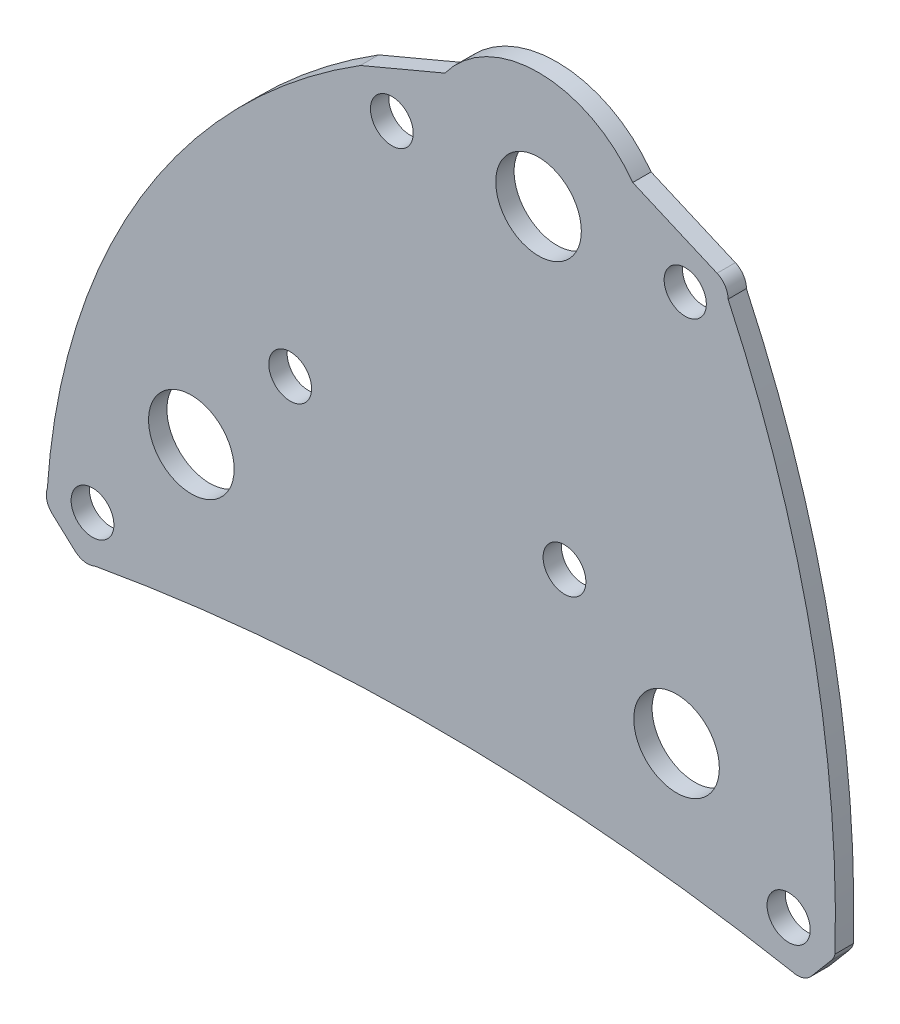
ISO-10303-21;
HEADER;
FILE_DESCRIPTION(('STEP AP214'),'2;1');
FILE_NAME('part.step','',(''),(''),'','','');
FILE_SCHEMA(('AUTOMOTIVE_DESIGN { 1 0 10303 214 1 1 1 1 }'));
ENDSEC;
DATA;
#1=APPLICATION_CONTEXT('core data for automotive mechanical design processes');
#2=APPLICATION_PROTOCOL_DEFINITION('international standard','automotive_design',2000,#1);
#3=PRODUCT_CONTEXT('',#1,'mechanical');
#4=PRODUCT('Part','Part','',(#3));
#5=PRODUCT_RELATED_PRODUCT_CATEGORY('part','',(#4));
#6=PRODUCT_DEFINITION_FORMATION('','',#4);
#7=PRODUCT_DEFINITION_CONTEXT('part definition',#1,'design');
#8=PRODUCT_DEFINITION('design','',#6,#7);
#9=PRODUCT_DEFINITION_SHAPE('','',#8);
#10=(LENGTH_UNIT() NAMED_UNIT(*) SI_UNIT(.MILLI.,.METRE.));
#11=(NAMED_UNIT(*) PLANE_ANGLE_UNIT() SI_UNIT($,.RADIAN.));
#12=(NAMED_UNIT(*) SI_UNIT($,.STERADIAN.) SOLID_ANGLE_UNIT());
#13=UNCERTAINTY_MEASURE_WITH_UNIT(LENGTH_MEASURE(1.E-05),#10,'distance_accuracy_value','');
#14=(GEOMETRIC_REPRESENTATION_CONTEXT(3) GLOBAL_UNCERTAINTY_ASSIGNED_CONTEXT((#13)) GLOBAL_UNIT_ASSIGNED_CONTEXT((#10,
#11,#12)) REPRESENTATION_CONTEXT('',''));
#15=CARTESIAN_POINT('',(0.,0.,0.));
#16=DIRECTION('',(0.,0.,1.));
#17=DIRECTION('',(1.,0.,0.));
#18=AXIS2_PLACEMENT_3D('',#15,#16,#17);
#19=CARTESIAN_POINT('',(0.,0.,0.));
#20=DIRECTION('',(0.,0.,1.));
#21=DIRECTION('',(1.,0.,0.));
#22=AXIS2_PLACEMENT_3D('',#19,#20,#21);
#23=PLANE('',#22);
#24=CARTESIAN_POINT('',(40.353251909671,33.0083620774095,0.));
#25=DIRECTION('',(0.,0.,1.));
#26=DIRECTION('',(1.,0.,0.));
#27=AXIS2_PLACEMENT_3D('',#24,#25,#26);
#28=CIRCLE('',#27,3.45134981416038);
#29=CARTESIAN_POINT('',(43.8046017238314,33.0083620774095,0.));
#30=VERTEX_POINT('',#29);
#31=EDGE_CURVE('E233',#30,#30,#28,.T.);
#32=ORIENTED_EDGE('',*,*,#31,.T.);
#33=EDGE_LOOP('',(#32));
#34=FACE_BOUND('',#33,.T.);
#35=CARTESIAN_POINT('',(-7.64626988032436,33.2226234406019,0.));
#36=DIRECTION('',(0.,0.,1.));
#37=DIRECTION('',(1.,0.,0.));
#38=AXIS2_PLACEMENT_3D('',#35,#36,#37);
#39=CIRCLE('',#38,3.50000000000215);
#40=CARTESIAN_POINT('',(-4.1462698803222,33.2226234406019,0.));
#41=VERTEX_POINT('',#40);
#42=EDGE_CURVE('E235',#41,#41,#39,.T.);
#43=ORIENTED_EDGE('',*,*,#42,.T.);
#44=EDGE_LOOP('',(#43));
#45=FACE_BOUND('',#44,.T.);
#46=CARTESIAN_POINT('',(-40.4489423174999,-29.0037757943381,0.));
#47=DIRECTION('',(0.,0.,1.));
#48=DIRECTION('',(1.,0.,0.));
#49=AXIS2_PLACEMENT_3D('',#46,#47,#48);
#50=CIRCLE('',#49,7.);
#51=CARTESIAN_POINT('',(-33.4489423174999,-29.0037757943381,0.));
#52=VERTEX_POINT('',#51);
#53=EDGE_CURVE('E240',#52,#52,#50,.T.);
#54=ORIENTED_EDGE('',*,*,#53,.T.);
#55=EDGE_LOOP('',(#54));
#56=FACE_BOUND('',#55,.T.);
#57=CARTESIAN_POINT('',(-56.6204144592569,-46.7374581183333,0.));
#58=DIRECTION('',(0.,0.,1.));
#59=DIRECTION('',(1.,0.,0.));
#60=AXIS2_PLACEMENT_3D('',#57,#58,#59);
#61=CIRCLE('',#60,3.50000000000215);
#62=CARTESIAN_POINT('',(-53.1204144592547,-46.7374581183333,0.));
#63=VERTEX_POINT('',#62);
#64=EDGE_CURVE('E243',#63,#63,#61,.T.);
#65=ORIENTED_EDGE('',*,*,#64,.T.);
#66=EDGE_LOOP('',(#65));
#67=FACE_BOUND('',#66,.T.);
#68=CARTESIAN_POINT('',(-24.2774701757374,-11.270093470348,0.));
#69=DIRECTION('',(0.,0.,1.));
#70=DIRECTION('',(1.,0.,0.));
#71=AXIS2_PLACEMENT_3D('',#68,#69,#70);
#72=CIRCLE('',#71,3.5);
#73=CARTESIAN_POINT('',(-20.7774701757374,-11.270093470348,0.));
#74=VERTEX_POINT('',#73);
#75=EDGE_CURVE('E246',#74,#74,#72,.T.);
#76=ORIENTED_EDGE('',*,*,#75,.T.);
#77=EDGE_LOOP('',(#76));
#78=FACE_BOUND('',#77,.T.);
#79=CARTESIAN_POINT('',(20.5982830562592,-16.190449825227,0.));
#80=DIRECTION('',(0.,0.,1.));
#81=DIRECTION('',(1.,0.,0.));
#82=AXIS2_PLACEMENT_3D('',#79,#80,#81);
#83=CIRCLE('',#82,3.5);
#84=CARTESIAN_POINT('',(24.0982830562592,-16.190449825227,0.));
#85=VERTEX_POINT('',#84);
#86=EDGE_CURVE('E249',#85,#85,#83,.T.);
#87=ORIENTED_EDGE('',*,*,#86,.T.);
#88=EDGE_LOOP('',(#87));
#89=FACE_BOUND('',#88,.T.);
#90=CARTESIAN_POINT('',(38.9338096491406,-31.6762001965116,0.));
#91=DIRECTION('',(0.,0.,1.));
#92=DIRECTION('',(1.,0.,0.));
#93=AXIS2_PLACEMENT_3D('',#90,#91,#92);
#94=CIRCLE('',#93,7.);
#95=CARTESIAN_POINT('',(45.9338096491406,-31.6762001965116,0.));
#96=VERTEX_POINT('',#95);
#97=EDGE_CURVE('E252',#96,#96,#94,.T.);
#98=ORIENTED_EDGE('',*,*,#97,.T.);
#99=EDGE_LOOP('',(#98));
#100=FACE_BOUND('',#99,.T.);
#101=CARTESIAN_POINT('',(57.2693362420269,-47.1619505677903,0.));
#102=DIRECTION('',(0.,0.,1.));
#103=DIRECTION('',(1.,0.,0.));
#104=AXIS2_PLACEMENT_3D('',#101,#102,#103);
#105=CIRCLE('',#104,3.53385235232845);
#106=CARTESIAN_POINT('',(60.8031885943554,-47.1619505677903,0.));
#107=VERTEX_POINT('',#106);
#108=EDGE_CURVE('E255',#107,#107,#105,.T.);
#109=ORIENTED_EDGE('',*,*,#108,.T.);
#110=EDGE_LOOP('',(#109));
#111=FACE_BOUND('',#110,.T.);
#112=CARTESIAN_POINT('',(16.3534910146734,33.1154927590095,0.));
#113=DIRECTION('',(0.,0.,1.));
#114=DIRECTION('',(1.,0.,0.));
#115=AXIS2_PLACEMENT_3D('',#112,#113,#114);
#116=CIRCLE('',#115,7.);
#117=CARTESIAN_POINT('',(23.3534910146734,33.1154927590095,0.));
#118=VERTEX_POINT('',#117);
#119=EDGE_CURVE('E258',#118,#118,#116,.T.);
#120=ORIENTED_EDGE('',*,*,#119,.T.);
#121=EDGE_LOOP('',(#120));
#122=FACE_BOUND('',#121,.T.);
#123=CARTESIAN_POINT('',(-57.4543314226771,-51.3904305551921,0.));
#124=DIRECTION('',(0.,0.,1.));
#125=DIRECTION('',(1.,0.,0.));
#126=AXIS2_PLACEMENT_3D('',#123,#124,#125);
#127=CIRCLE('',#126,3.);
#128=CARTESIAN_POINT('',(-59.4757654403967,-53.6071408456915,0.));
#129=VERTEX_POINT('',#128);
#130=CARTESIAN_POINT('',(-56.2096223216723,-54.1200274583769,0.));
#131=VERTEX_POINT('',#130);
#132=EDGE_CURVE('E11',#129,#131,#127,.T.);
#133=ORIENTED_EDGE('',*,*,#132,.F.);
#134=DIRECTION('',(0.738903430166466,-0.673811339239873,0.));
#135=VECTOR('',#134,1.);
#136=CARTESIAN_POINT('',(-53.6932935993561,-58.8802184039465,0.));
#137=LINE('',#136,#135);
#138=CARTESIAN_POINT('',(-63.1984222274842,-50.2124234133029,0.));
#139=VERTEX_POINT('',#138);
#140=EDGE_CURVE('E40',#139,#129,#137,.T.);
#141=ORIENTED_EDGE('',*,*,#140,.F.);
#142=CARTESIAN_POINT('',(-61.1769882097646,-47.9957131228035,0.));
#143=DIRECTION('',(0.,0.,1.));
#144=DIRECTION('',(1.,0.,0.));
#145=AXIS2_PLACEMENT_3D('',#142,#143,#144);
#146=CIRCLE('',#145,2.99999999999999);
#147=CARTESIAN_POINT('',(-64.0094790295578,-47.0072821662934,0.));
#148=VERTEX_POINT('',#147);
#149=EDGE_CURVE('E218',#148,#139,#146,.T.);
#150=ORIENTED_EDGE('',*,*,#149,.F.);
#151=CARTESIAN_POINT('',(45.218651989678,-54.3085822873816,0.));
#152=DIRECTION('',(0.,0.,1.));
#153=DIRECTION('',(1.,0.,0.));
#154=AXIS2_PLACEMENT_3D('',#151,#152,#153);
#155=CIRCLE('',#154,109.471884926741);
#156=CARTESIAN_POINT('',(-12.800867901229,38.5236798903882,0.));
#157=VERTEX_POINT('',#156);
#158=EDGE_CURVE('E216',#157,#148,#155,.T.);
#159=ORIENTED_EDGE('',*,*,#158,.F.);
#160=DIRECTION('',(-0.921394982758008,-0.388627438234061,0.));
#161=VECTOR('',#160,1.);
#162=CARTESIAN_POINT('',(-15.727866630503,37.2891257207234,0.));
#163=LINE('',#162,#161);
#164=CARTESIAN_POINT('',(1.038853262976,44.3610194489554,0.));
#165=VERTEX_POINT('',#164);
#166=EDGE_CURVE('E214',#165,#157,#163,.T.);
#167=ORIENTED_EDGE('',*,*,#166,.F.);
#168=CARTESIAN_POINT('',(16.3534910146734,33.1154927590095,0.));
#169=DIRECTION('',(0.,0.,1.));
#170=DIRECTION('',(1.,0.,0.));
#171=AXIS2_PLACEMENT_3D('',#168,#169,#170);
#172=CIRCLE('',#171,19.);
#173=CARTESIAN_POINT('',(31.7679125463883,44.2238503713031,0.));
#174=VERTEX_POINT('',#173);
#175=EDGE_CURVE('E212',#174,#165,#172,.T.);
#176=ORIENTED_EDGE('',*,*,#175,.F.);
#177=DIRECTION('',(-0.917888805619267,0.396837675276474,0.));
#178=VECTOR('',#177,1.);
#179=CARTESIAN_POINT('',(21.1114793002132,48.8310251949442,0.));
#180=LINE('',#179,#178);
#181=CARTESIAN_POINT('',(45.5549695276355,38.2631897685723,0.));
#182=VERTEX_POINT('',#181);
#183=EDGE_CURVE('E210',#182,#174,#180,.T.);
#184=ORIENTED_EDGE('',*,*,#183,.F.);
#185=CARTESIAN_POINT('',(44.3644565018061,35.5095233517145,0.));
#186=DIRECTION('',(0.,0.,1.));
#187=DIRECTION('',(1.,0.,0.));
#188=AXIS2_PLACEMENT_3D('',#185,#186,#187);
#189=CIRCLE('',#188,3.);
#190=CARTESIAN_POINT('',(47.3644266136808,35.4961320165145,0.));
#191=VERTEX_POINT('',#190);
#192=EDGE_CURVE('E208',#191,#182,#189,.T.);
#193=ORIENTED_EDGE('',*,*,#192,.F.);
#194=CARTESIAN_POINT('',(-122.38787438255,-43.6812857915708,0.));
#195=DIRECTION('',(0.,0.,1.));
#196=DIRECTION('',(1.,0.,0.));
#197=AXIS2_PLACEMENT_3D('',#194,#195,#196);
#198=CIRCLE('',#197,187.309655875694);
#199=CARTESIAN_POINT('',(64.8583139102552,-48.5569553954693,0.));
#200=VERTEX_POINT('',#199);
#201=EDGE_CURVE('E206',#200,#191,#198,.T.);
#202=ORIENTED_EDGE('',*,*,#201,.F.);
#203=CARTESIAN_POINT('',(61.9506426575936,-47.8184109577778,0.));
#204=DIRECTION('',(0.,0.,1.));
#205=DIRECTION('',(1.,0.,0.));
#206=AXIS2_PLACEMENT_3D('',#203,#204,#205);
#207=CIRCLE('',#206,2.99999999999999);
#208=CARTESIAN_POINT('',(64.2425834817043,-49.7541297541876,0.));
#209=VERTEX_POINT('',#208);
#210=EDGE_CURVE('E204',#209,#200,#207,.T.);
#211=ORIENTED_EDGE('',*,*,#210,.F.);
#212=DIRECTION('',(0.645239598803281,0.763980274703596,0.));
#213=VECTOR('',#212,1.);
#214=CARTESIAN_POINT('',(62.0225172245748,-52.3827452826327,0.));
#215=LINE('',#214,#213);
#216=CARTESIAN_POINT('',(60.9918128481974,-53.6031257646482,0.));
#217=VERTEX_POINT('',#216);
#218=EDGE_CURVE('E202',#217,#209,#215,.T.);
#219=ORIENTED_EDGE('',*,*,#218,.F.);
#220=CARTESIAN_POINT('',(58.6998720240867,-51.6674069682383,0.));
#221=DIRECTION('',(0.,0.,1.));
#222=DIRECTION('',(1.,0.,0.));
#223=AXIS2_PLACEMENT_3D('',#220,#221,#222);
#224=CIRCLE('',#223,3.);
#225=CARTESIAN_POINT('',(57.8198149355712,-54.5354201343437,0.));
#226=VERTEX_POINT('',#225);
#227=EDGE_CURVE('E129',#226,#217,#224,.T.);
#228=ORIENTED_EDGE('',*,*,#227,.F.);
#229=CARTESIAN_POINT('',(-0.331994626950241,-366.47053902802,0.));
#230=DIRECTION('',(0.,0.,1.));
#231=DIRECTION('',(1.,0.,0.));
#232=AXIS2_PLACEMENT_3D('',#229,#230,#231);
#233=CIRCLE('',#232,317.309236163412);
#234=EDGE_CURVE('E180',#131,#226,#233,.F.);
#235=ORIENTED_EDGE('',*,*,#234,.F.);
#236=EDGE_LOOP('',(#133,#141,#150,#159,#167,#176,#184,#193,#202,#211,#219,#228,#235));
#237=FACE_BOUND('',#236,.T.);
#238=ADVANCED_FACE('F33',(#34,#45,#56,#67,#78,#89,#100,#111,#122,#237),#23,.F.);
#239=CARTESIAN_POINT('',(-57.4543314226771,-51.3904305551921,-7.));
#240=DIRECTION('',(0.,0.,1.));
#241=DIRECTION('',(1.,0.,0.));
#242=AXIS2_PLACEMENT_3D('',#239,#240,#241);
#243=CYLINDRICAL_SURFACE('',#242,3.);
#244=ORIENTED_EDGE('',*,*,#132,.T.);
#245=DIRECTION('',(0.,0.,1.));
#246=VECTOR('',#245,1.);
#247=CARTESIAN_POINT('',(-56.2096223216723,-54.1200274583769,-7.));
#248=LINE('',#247,#246);
#249=CARTESIAN_POINT('',(-56.2096223216723,-54.1200274583769,3.));
#250=VERTEX_POINT('',#249);
#251=EDGE_CURVE('E55',#131,#250,#248,.T.);
#252=ORIENTED_EDGE('',*,*,#251,.T.);
#253=CARTESIAN_POINT('',(-57.4543314226771,-51.3904305551921,3.));
#254=DIRECTION('',(0.,0.,1.));
#255=DIRECTION('',(1.,0.,0.));
#256=AXIS2_PLACEMENT_3D('',#253,#254,#255);
#257=CIRCLE('',#256,3.);
#258=CARTESIAN_POINT('',(-59.4757654403967,-53.6071408456915,3.));
#259=VERTEX_POINT('',#258);
#260=EDGE_CURVE('E150',#259,#250,#257,.T.);
#261=ORIENTED_EDGE('',*,*,#260,.F.);
#262=DIRECTION('',(0.,0.,1.));
#263=VECTOR('',#262,1.);
#264=CARTESIAN_POINT('',(-59.4757654403967,-53.6071408456915,-7.));
#265=LINE('',#264,#263);
#266=EDGE_CURVE('E178',#129,#259,#265,.T.);
#267=ORIENTED_EDGE('',*,*,#266,.F.);
#268=EDGE_LOOP('',(#244,#252,#261,#267));
#269=FACE_BOUND('',#268,.T.);
#270=ADVANCED_FACE('F230',(#269),#243,.T.);
#271=CARTESIAN_POINT('',(-59.4757654403967,-53.6071408456915,-7.));
#272=DIRECTION('',(-0.673811339239873,-0.738903430166466,0.));
#273=DIRECTION('',(0.738903430166466,-0.673811339239873,0.));
#274=AXIS2_PLACEMENT_3D('',#271,#272,#273);
#275=PLANE('',#274);
#276=ORIENTED_EDGE('',*,*,#140,.T.);
#277=ORIENTED_EDGE('',*,*,#266,.T.);
#278=DIRECTION('',(0.738903430166466,-0.673811339239873,0.));
#279=VECTOR('',#278,1.);
#280=CARTESIAN_POINT('',(-59.4757654403967,-53.6071408456915,3.));
#281=LINE('',#280,#279);
#282=CARTESIAN_POINT('',(-63.1984222274842,-50.2124234133029,3.));
#283=VERTEX_POINT('',#282);
#284=EDGE_CURVE('E176',#283,#259,#281,.T.);
#285=ORIENTED_EDGE('',*,*,#284,.F.);
#286=DIRECTION('',(0.,0.,1.));
#287=VECTOR('',#286,1.);
#288=CARTESIAN_POINT('',(-63.1984222274842,-50.2124234133029,-7.));
#289=LINE('',#288,#287);
#290=EDGE_CURVE('E181',#139,#283,#289,.T.);
#291=ORIENTED_EDGE('',*,*,#290,.F.);
#292=EDGE_LOOP('',(#276,#277,#285,#291));
#293=FACE_BOUND('',#292,.T.);
#294=ADVANCED_FACE('F223',(#293),#275,.T.);
#295=CARTESIAN_POINT('',(-61.1769882097646,-47.9957131228035,-7.));
#296=DIRECTION('',(0.,0.,1.));
#297=DIRECTION('',(1.,0.,0.));
#298=AXIS2_PLACEMENT_3D('',#295,#296,#297);
#299=CYLINDRICAL_SURFACE('',#298,2.99999999999999);
#300=ORIENTED_EDGE('',*,*,#149,.T.);
#301=ORIENTED_EDGE('',*,*,#290,.T.);
#302=CARTESIAN_POINT('',(-61.1769882097646,-47.9957131228035,3.));
#303=DIRECTION('',(0.,0.,1.));
#304=DIRECTION('',(1.,0.,0.));
#305=AXIS2_PLACEMENT_3D('',#302,#303,#304);
#306=CIRCLE('',#305,2.99999999999999);
#307=CARTESIAN_POINT('',(-64.0094790295578,-47.0072821662934,3.));
#308=VERTEX_POINT('',#307);
#309=EDGE_CURVE('E173',#308,#283,#306,.T.);
#310=ORIENTED_EDGE('',*,*,#309,.F.);
#311=DIRECTION('',(0.,0.,1.));
#312=VECTOR('',#311,1.);
#313=CARTESIAN_POINT('',(-64.0094790295578,-47.0072821662934,-7.));
#314=LINE('',#313,#312);
#315=EDGE_CURVE('E183',#148,#308,#314,.T.);
#316=ORIENTED_EDGE('',*,*,#315,.F.);
#317=EDGE_LOOP('',(#300,#301,#310,#316));
#318=FACE_BOUND('',#317,.T.);
#319=ADVANCED_FACE('F362',(#318),#299,.T.);
#320=CARTESIAN_POINT('',(45.218651989678,-54.3085822873816,-7.));
#321=DIRECTION('',(0.,0.,1.));
#322=DIRECTION('',(1.,0.,0.));
#323=AXIS2_PLACEMENT_3D('',#320,#321,#322);
#324=CYLINDRICAL_SURFACE('',#323,109.471884926741);
#325=ORIENTED_EDGE('',*,*,#158,.T.);
#326=ORIENTED_EDGE('',*,*,#315,.T.);
#327=CARTESIAN_POINT('',(45.218651989678,-54.3085822873816,3.));
#328=DIRECTION('',(0.,0.,1.));
#329=DIRECTION('',(-1.,0.,0.));
#330=AXIS2_PLACEMENT_3D('',#327,#328,#329);
#331=CIRCLE('',#330,109.471884926741);
#332=CARTESIAN_POINT('',(-12.800867901229,38.5236798903882,3.));
#333=VERTEX_POINT('',#332);
#334=EDGE_CURVE('E170',#333,#308,#331,.T.);
#335=ORIENTED_EDGE('',*,*,#334,.F.);
#336=DIRECTION('',(0.,0.,1.));
#337=VECTOR('',#336,1.);
#338=CARTESIAN_POINT('',(-12.800867901229,38.5236798903882,-7.));
#339=LINE('',#338,#337);
#340=EDGE_CURVE('E185',#157,#333,#339,.T.);
#341=ORIENTED_EDGE('',*,*,#340,.F.);
#342=EDGE_LOOP('',(#325,#326,#335,#341));
#343=FACE_BOUND('',#342,.T.);
#344=ADVANCED_FACE('F365',(#343),#324,.T.);
#345=CARTESIAN_POINT('',(-12.800867901229,38.5236798903882,-7.));
#346=DIRECTION('',(-0.388627438234061,0.921394982758008,0.));
#347=DIRECTION('',(-0.921394982758008,-0.388627438234061,0.));
#348=AXIS2_PLACEMENT_3D('',#345,#346,#347);
#349=PLANE('',#348);
#350=ORIENTED_EDGE('',*,*,#166,.T.);
#351=ORIENTED_EDGE('',*,*,#340,.T.);
#352=DIRECTION('',(-0.921394982758009,-0.388627438234061,0.));
#353=VECTOR('',#352,1.);
#354=CARTESIAN_POINT('',(-12.800867901229,38.5236798903882,3.));
#355=LINE('',#354,#353);
#356=CARTESIAN_POINT('',(1.038853262976,44.3610194489554,3.));
#357=VERTEX_POINT('',#356);
#358=EDGE_CURVE('E167',#357,#333,#355,.T.);
#359=ORIENTED_EDGE('',*,*,#358,.F.);
#360=DIRECTION('',(0.,0.,1.));
#361=VECTOR('',#360,1.);
#362=CARTESIAN_POINT('',(1.038853262976,44.3610194489554,-7.));
#363=LINE('',#362,#361);
#364=EDGE_CURVE('E187',#165,#357,#363,.T.);
#365=ORIENTED_EDGE('',*,*,#364,.F.);
#366=EDGE_LOOP('',(#350,#351,#359,#365));
#367=FACE_BOUND('',#366,.T.);
#368=ADVANCED_FACE('F369',(#367),#349,.T.);
#369=CARTESIAN_POINT('',(16.3534910146734,33.1154927590095,-7.));
#370=DIRECTION('',(0.,0.,1.));
#371=DIRECTION('',(1.,0.,0.));
#372=AXIS2_PLACEMENT_3D('',#369,#370,#371);
#373=CYLINDRICAL_SURFACE('',#372,19.);
#374=ORIENTED_EDGE('',*,*,#175,.T.);
#375=ORIENTED_EDGE('',*,*,#364,.T.);
#376=CARTESIAN_POINT('',(16.3534910146734,33.1154927590095,3.));
#377=DIRECTION('',(0.,0.,1.));
#378=DIRECTION('',(1.,0.,0.));
#379=AXIS2_PLACEMENT_3D('',#376,#377,#378);
#380=CIRCLE('',#379,19.);
#381=CARTESIAN_POINT('',(31.7679125463883,44.2238503713031,3.));
#382=VERTEX_POINT('',#381);
#383=EDGE_CURVE('E164',#382,#357,#380,.T.);
#384=ORIENTED_EDGE('',*,*,#383,.F.);
#385=DIRECTION('',(0.,0.,1.));
#386=VECTOR('',#385,1.);
#387=CARTESIAN_POINT('',(31.7679125463883,44.2238503713031,-7.));
#388=LINE('',#387,#386);
#389=EDGE_CURVE('E189',#174,#382,#388,.T.);
#390=ORIENTED_EDGE('',*,*,#389,.F.);
#391=EDGE_LOOP('',(#374,#375,#384,#390));
#392=FACE_BOUND('',#391,.T.);
#393=ADVANCED_FACE('F373',(#392),#373,.T.);
#394=CARTESIAN_POINT('',(45.5549695276355,38.2631897685723,-7.));
#395=DIRECTION('',(0.396837675276474,0.917888805619267,0.));
#396=DIRECTION('',(-0.917888805619267,0.396837675276474,0.));
#397=AXIS2_PLACEMENT_3D('',#394,#395,#396);
#398=PLANE('',#397);
#399=ORIENTED_EDGE('',*,*,#183,.T.);
#400=ORIENTED_EDGE('',*,*,#389,.T.);
#401=DIRECTION('',(-0.917888805619267,0.396837675276474,0.));
#402=VECTOR('',#401,1.);
#403=CARTESIAN_POINT('',(45.5549695276355,38.2631897685723,3.));
#404=LINE('',#403,#402);
#405=CARTESIAN_POINT('',(45.5549695276355,38.2631897685723,3.));
#406=VERTEX_POINT('',#405);
#407=EDGE_CURVE('E161',#406,#382,#404,.T.);
#408=ORIENTED_EDGE('',*,*,#407,.F.);
#409=DIRECTION('',(0.,0.,1.));
#410=VECTOR('',#409,1.);
#411=CARTESIAN_POINT('',(45.5549695276355,38.2631897685723,-7.));
#412=LINE('',#411,#410);
#413=EDGE_CURVE('E191',#182,#406,#412,.T.);
#414=ORIENTED_EDGE('',*,*,#413,.F.);
#415=EDGE_LOOP('',(#399,#400,#408,#414));
#416=FACE_BOUND('',#415,.T.);
#417=ADVANCED_FACE('F377',(#416),#398,.T.);
#418=CARTESIAN_POINT('',(44.3644565018061,35.5095233517145,-7.));
#419=DIRECTION('',(0.,0.,1.));
#420=DIRECTION('',(1.,0.,0.));
#421=AXIS2_PLACEMENT_3D('',#418,#419,#420);
#422=CYLINDRICAL_SURFACE('',#421,3.);
#423=ORIENTED_EDGE('',*,*,#192,.T.);
#424=ORIENTED_EDGE('',*,*,#413,.T.);
#425=CARTESIAN_POINT('',(44.3644565018061,35.5095233517145,3.));
#426=DIRECTION('',(0.,0.,1.));
#427=DIRECTION('',(1.,0.,0.));
#428=AXIS2_PLACEMENT_3D('',#425,#426,#427);
#429=CIRCLE('',#428,3.);
#430=CARTESIAN_POINT('',(47.3644266136808,35.4961320165145,3.));
#431=VERTEX_POINT('',#430);
#432=EDGE_CURVE('E158',#431,#406,#429,.T.);
#433=ORIENTED_EDGE('',*,*,#432,.F.);
#434=DIRECTION('',(0.,0.,1.));
#435=VECTOR('',#434,1.);
#436=CARTESIAN_POINT('',(47.3644266136808,35.4961320165145,-7.));
#437=LINE('',#436,#435);
#438=EDGE_CURVE('E193',#191,#431,#437,.T.);
#439=ORIENTED_EDGE('',*,*,#438,.F.);
#440=EDGE_LOOP('',(#423,#424,#433,#439));
#441=FACE_BOUND('',#440,.T.);
#442=ADVANCED_FACE('F381',(#441),#422,.T.);
#443=CARTESIAN_POINT('',(-122.38787438255,-43.6812857915708,-7.));
#444=DIRECTION('',(0.,0.,1.));
#445=DIRECTION('',(1.,0.,0.));
#446=AXIS2_PLACEMENT_3D('',#443,#444,#445);
#447=CYLINDRICAL_SURFACE('',#446,187.309655875694);
#448=ORIENTED_EDGE('',*,*,#201,.T.);
#449=ORIENTED_EDGE('',*,*,#438,.T.);
#450=CARTESIAN_POINT('',(-122.38787438255,-43.6812857915708,3.));
#451=DIRECTION('',(0.,0.,1.));
#452=DIRECTION('',(-1.,0.,0.));
#453=AXIS2_PLACEMENT_3D('',#450,#451,#452);
#454=CIRCLE('',#453,187.309655875694);
#455=CARTESIAN_POINT('',(64.8583139102552,-48.5569553954693,3.));
#456=VERTEX_POINT('',#455);
#457=EDGE_CURVE('E155',#456,#431,#454,.T.);
#458=ORIENTED_EDGE('',*,*,#457,.F.);
#459=DIRECTION('',(0.,0.,1.));
#460=VECTOR('',#459,1.);
#461=CARTESIAN_POINT('',(64.8583139102552,-48.5569553954693,-7.));
#462=LINE('',#461,#460);
#463=EDGE_CURVE('E195',#200,#456,#462,.T.);
#464=ORIENTED_EDGE('',*,*,#463,.F.);
#465=EDGE_LOOP('',(#448,#449,#458,#464));
#466=FACE_BOUND('',#465,.T.);
#467=ADVANCED_FACE('F385',(#466),#447,.T.);
#468=CARTESIAN_POINT('',(61.9506426575936,-47.8184109577778,-7.));
#469=DIRECTION('',(0.,0.,1.));
#470=DIRECTION('',(1.,0.,0.));
#471=AXIS2_PLACEMENT_3D('',#468,#469,#470);
#472=CYLINDRICAL_SURFACE('',#471,2.99999999999999);
#473=ORIENTED_EDGE('',*,*,#210,.T.);
#474=ORIENTED_EDGE('',*,*,#463,.T.);
#475=CARTESIAN_POINT('',(61.9506426575936,-47.8184109577778,3.));
#476=DIRECTION('',(0.,0.,1.));
#477=DIRECTION('',(1.,0.,0.));
#478=AXIS2_PLACEMENT_3D('',#475,#476,#477);
#479=CIRCLE('',#478,2.99999999999999);
#480=CARTESIAN_POINT('',(64.2425834817043,-49.7541297541876,3.));
#481=VERTEX_POINT('',#480);
#482=EDGE_CURVE('E142',#481,#456,#479,.T.);
#483=ORIENTED_EDGE('',*,*,#482,.F.);
#484=DIRECTION('',(0.,0.,1.));
#485=VECTOR('',#484,1.);
#486=CARTESIAN_POINT('',(64.2425834817043,-49.7541297541876,-7.));
#487=LINE('',#486,#485);
#488=EDGE_CURVE('E132',#209,#481,#487,.T.);
#489=ORIENTED_EDGE('',*,*,#488,.F.);
#490=EDGE_LOOP('',(#473,#474,#483,#489));
#491=FACE_BOUND('',#490,.T.);
#492=ADVANCED_FACE('F389',(#491),#472,.T.);
#493=CARTESIAN_POINT('',(60.9918128481974,-53.6031257646482,-7.));
#494=DIRECTION('',(0.763980274703596,-0.645239598803281,0.));
#495=DIRECTION('',(0.645239598803281,0.763980274703596,0.));
#496=AXIS2_PLACEMENT_3D('',#493,#494,#495);
#497=PLANE('',#496);
#498=ORIENTED_EDGE('',*,*,#218,.T.);
#499=ORIENTED_EDGE('',*,*,#488,.T.);
#500=DIRECTION('',(0.64523959880328,0.763980274703596,0.));
#501=VECTOR('',#500,1.);
#502=CARTESIAN_POINT('',(60.9918128481974,-53.6031257646482,3.));
#503=LINE('',#502,#501);
#504=CARTESIAN_POINT('',(60.9918128481974,-53.6031257646482,3.));
#505=VERTEX_POINT('',#504);
#506=EDGE_CURVE('E136',#505,#481,#503,.T.);
#507=ORIENTED_EDGE('',*,*,#506,.F.);
#508=DIRECTION('',(0.,0.,1.));
#509=VECTOR('',#508,1.);
#510=CARTESIAN_POINT('',(60.9918128481974,-53.6031257646482,-7.));
#511=LINE('',#510,#509);
#512=EDGE_CURVE('E125',#217,#505,#511,.T.);
#513=ORIENTED_EDGE('',*,*,#512,.F.);
#514=EDGE_LOOP('',(#498,#499,#507,#513));
#515=FACE_BOUND('',#514,.T.);
#516=ADVANCED_FACE('F137',(#515),#497,.T.);
#517=CARTESIAN_POINT('',(58.6998720240867,-51.6674069682383,-7.));
#518=DIRECTION('',(0.,0.,1.));
#519=DIRECTION('',(1.,0.,0.));
#520=AXIS2_PLACEMENT_3D('',#517,#518,#519);
#521=CYLINDRICAL_SURFACE('',#520,3.);
#522=ORIENTED_EDGE('',*,*,#227,.T.);
#523=ORIENTED_EDGE('',*,*,#512,.T.);
#524=CARTESIAN_POINT('',(58.6998720240867,-51.6674069682383,3.));
#525=DIRECTION('',(0.,0.,1.));
#526=DIRECTION('',(1.,0.,0.));
#527=AXIS2_PLACEMENT_3D('',#524,#525,#526);
#528=CIRCLE('',#527,3.);
#529=CARTESIAN_POINT('',(57.8198149355712,-54.5354201343436,3.));
#530=VERTEX_POINT('',#529);
#531=EDGE_CURVE('E47',#530,#505,#528,.T.);
#532=ORIENTED_EDGE('',*,*,#531,.F.);
#533=DIRECTION('',(0.,0.,1.));
#534=VECTOR('',#533,1.);
#535=CARTESIAN_POINT('',(57.8198149355712,-54.5354201343437,-7.));
#536=LINE('',#535,#534);
#537=EDGE_CURVE('E133',#226,#530,#536,.T.);
#538=ORIENTED_EDGE('',*,*,#537,.F.);
#539=EDGE_LOOP('',(#522,#523,#532,#538));
#540=FACE_BOUND('',#539,.T.);
#541=ADVANCED_FACE('F127',(#540),#521,.T.);
#542=CARTESIAN_POINT('',(-0.331994626950241,-366.47053902802,-7.));
#543=DIRECTION('',(0.,0.,1.));
#544=DIRECTION('',(1.,0.,0.));
#545=AXIS2_PLACEMENT_3D('',#542,#543,#544);
#546=CYLINDRICAL_SURFACE('',#545,317.309236163412);
#547=ORIENTED_EDGE('',*,*,#234,.T.);
#548=ORIENTED_EDGE('',*,*,#537,.T.);
#549=CARTESIAN_POINT('',(-0.331994626950241,-366.47053902802,3.));
#550=DIRECTION('',(0.,0.,-1.));
#551=DIRECTION('',(1.,0.,0.));
#552=AXIS2_PLACEMENT_3D('',#549,#550,#551);
#553=CIRCLE('',#552,317.309236163412);
#554=EDGE_CURVE('E148',#250,#530,#553,.T.);
#555=ORIENTED_EDGE('',*,*,#554,.F.);
#556=ORIENTED_EDGE('',*,*,#251,.F.);
#557=EDGE_LOOP('',(#547,#548,#555,#556));
#558=FACE_BOUND('',#557,.T.);
#559=ADVANCED_FACE('F232',(#558),#546,.F.);
#560=CARTESIAN_POINT('',(0.,0.,3.));
#561=DIRECTION('',(0.,0.,1.));
#562=DIRECTION('',(1.,0.,0.));
#563=AXIS2_PLACEMENT_3D('',#560,#561,#562);
#564=PLANE('',#563);
#565=CARTESIAN_POINT('',(40.353251909671,33.0083620774095,3.));
#566=DIRECTION('',(0.,0.,1.));
#567=DIRECTION('',(1.,0.,0.));
#568=AXIS2_PLACEMENT_3D('',#565,#566,#567);
#569=CIRCLE('',#568,3.45134981416038);
#570=CARTESIAN_POINT('',(43.8046017238314,33.0083620774095,3.));
#571=VERTEX_POINT('',#570);
#572=EDGE_CURVE('E264',#571,#571,#569,.T.);
#573=ORIENTED_EDGE('',*,*,#572,.F.);
#574=EDGE_LOOP('',(#573));
#575=FACE_BOUND('',#574,.T.);
#576=CARTESIAN_POINT('',(-7.64626988032436,33.2226234406019,3.));
#577=DIRECTION('',(0.,0.,1.));
#578=DIRECTION('',(1.,0.,0.));
#579=AXIS2_PLACEMENT_3D('',#576,#577,#578);
#580=CIRCLE('',#579,3.50000000000215);
#581=CARTESIAN_POINT('',(-4.1462698803222,33.2226234406019,3.));
#582=VERTEX_POINT('',#581);
#583=EDGE_CURVE('E272',#582,#582,#580,.T.);
#584=ORIENTED_EDGE('',*,*,#583,.F.);
#585=EDGE_LOOP('',(#584));
#586=FACE_BOUND('',#585,.T.);
#587=CARTESIAN_POINT('',(-40.4489423174999,-29.0037757943381,3.));
#588=DIRECTION('',(0.,0.,1.));
#589=DIRECTION('',(1.,0.,0.));
#590=AXIS2_PLACEMENT_3D('',#587,#588,#589);
#591=CIRCLE('',#590,7.);
#592=CARTESIAN_POINT('',(-33.4489423174999,-29.0037757943381,3.));
#593=VERTEX_POINT('',#592);
#594=EDGE_CURVE('E268',#593,#593,#591,.T.);
#595=ORIENTED_EDGE('',*,*,#594,.F.);
#596=EDGE_LOOP('',(#595));
#597=FACE_BOUND('',#596,.T.);
#598=CARTESIAN_POINT('',(-56.6204144592569,-46.7374581183333,3.));
#599=DIRECTION('',(0.,0.,1.));
#600=DIRECTION('',(1.,0.,0.));
#601=AXIS2_PLACEMENT_3D('',#598,#599,#600);
#602=CIRCLE('',#601,3.50000000000215);
#603=CARTESIAN_POINT('',(-53.1204144592547,-46.7374581183333,3.));
#604=VERTEX_POINT('',#603);
#605=EDGE_CURVE('E265',#604,#604,#602,.T.);
#606=ORIENTED_EDGE('',*,*,#605,.F.);
#607=EDGE_LOOP('',(#606));
#608=FACE_BOUND('',#607,.T.);
#609=CARTESIAN_POINT('',(-24.2774701757374,-11.270093470348,3.));
#610=DIRECTION('',(0.,0.,1.));
#611=DIRECTION('',(1.,0.,0.));
#612=AXIS2_PLACEMENT_3D('',#609,#610,#611);
#613=CIRCLE('',#612,3.5);
#614=CARTESIAN_POINT('',(-20.7774701757374,-11.270093470348,3.));
#615=VERTEX_POINT('',#614);
#616=EDGE_CURVE('E269',#615,#615,#613,.T.);
#617=ORIENTED_EDGE('',*,*,#616,.F.);
#618=EDGE_LOOP('',(#617));
#619=FACE_BOUND('',#618,.T.);
#620=CARTESIAN_POINT('',(20.5982830562592,-16.190449825227,3.));
#621=DIRECTION('',(0.,0.,1.));
#622=DIRECTION('',(1.,0.,0.));
#623=AXIS2_PLACEMENT_3D('',#620,#621,#622);
#624=CIRCLE('',#623,3.5);
#625=CARTESIAN_POINT('',(24.0982830562592,-16.190449825227,3.));
#626=VERTEX_POINT('',#625);
#627=EDGE_CURVE('E283',#626,#626,#624,.T.);
#628=ORIENTED_EDGE('',*,*,#627,.F.);
#629=EDGE_LOOP('',(#628));
#630=FACE_BOUND('',#629,.T.);
#631=CARTESIAN_POINT('',(38.9338096491406,-31.6762001965116,3.));
#632=DIRECTION('',(0.,0.,1.));
#633=DIRECTION('',(1.,0.,0.));
#634=AXIS2_PLACEMENT_3D('',#631,#632,#633);
#635=CIRCLE('',#634,7.);
#636=CARTESIAN_POINT('',(45.9338096491406,-31.6762001965116,3.));
#637=VERTEX_POINT('',#636);
#638=EDGE_CURVE('E280',#637,#637,#635,.T.);
#639=ORIENTED_EDGE('',*,*,#638,.F.);
#640=EDGE_LOOP('',(#639));
#641=FACE_BOUND('',#640,.T.);
#642=CARTESIAN_POINT('',(57.2693362420269,-47.1619505677903,3.));
#643=DIRECTION('',(0.,0.,1.));
#644=DIRECTION('',(1.,0.,0.));
#645=AXIS2_PLACEMENT_3D('',#642,#643,#644);
#646=CIRCLE('',#645,3.53385235232845);
#647=CARTESIAN_POINT('',(60.8031885943554,-47.1619505677903,3.));
#648=VERTEX_POINT('',#647);
#649=EDGE_CURVE('E277',#648,#648,#646,.T.);
#650=ORIENTED_EDGE('',*,*,#649,.F.);
#651=EDGE_LOOP('',(#650));
#652=FACE_BOUND('',#651,.T.);
#653=CARTESIAN_POINT('',(16.3534910146734,33.1154927590095,3.));
#654=DIRECTION('',(0.,0.,1.));
#655=DIRECTION('',(1.,0.,0.));
#656=AXIS2_PLACEMENT_3D('',#653,#654,#655);
#657=CIRCLE('',#656,7.);
#658=CARTESIAN_POINT('',(23.3534910146734,33.1154927590095,3.));
#659=VERTEX_POINT('',#658);
#660=EDGE_CURVE('E261',#659,#659,#657,.T.);
#661=ORIENTED_EDGE('',*,*,#660,.F.);
#662=EDGE_LOOP('',(#661));
#663=FACE_BOUND('',#662,.T.);
#664=ORIENTED_EDGE('',*,*,#284,.T.);
#665=ORIENTED_EDGE('',*,*,#260,.T.);
#666=ORIENTED_EDGE('',*,*,#554,.T.);
#667=ORIENTED_EDGE('',*,*,#531,.T.);
#668=ORIENTED_EDGE('',*,*,#506,.T.);
#669=ORIENTED_EDGE('',*,*,#482,.T.);
#670=ORIENTED_EDGE('',*,*,#457,.T.);
#671=ORIENTED_EDGE('',*,*,#432,.T.);
#672=ORIENTED_EDGE('',*,*,#407,.T.);
#673=ORIENTED_EDGE('',*,*,#383,.T.);
#674=ORIENTED_EDGE('',*,*,#358,.T.);
#675=ORIENTED_EDGE('',*,*,#334,.T.);
#676=ORIENTED_EDGE('',*,*,#309,.T.);
#677=EDGE_LOOP('',(#664,#665,#666,#667,#668,#669,#670,#671,#672,#673,#674,#675,#676));
#678=FACE_BOUND('',#677,.T.);
#679=ADVANCED_FACE('F146',(#575,#586,#597,#608,#619,#630,#641,#652,#663,#678),#564,.T.);
#680=CARTESIAN_POINT('',(16.3534910146734,33.1154927590095,-7.));
#681=DIRECTION('',(0.,0.,1.));
#682=DIRECTION('',(1.,0.,0.));
#683=AXIS2_PLACEMENT_3D('',#680,#681,#682);
#684=CYLINDRICAL_SURFACE('',#683,7.);
#685=ORIENTED_EDGE('',*,*,#660,.T.);
#686=EDGE_LOOP('',(#685));
#687=FACE_BOUND('',#686,.T.);
#688=ORIENTED_EDGE('',*,*,#119,.F.);
#689=EDGE_LOOP('',(#688));
#690=FACE_BOUND('',#689,.T.);
#691=ADVANCED_FACE('F294',(#687,#690),#684,.F.);
#692=CARTESIAN_POINT('',(57.2693362420269,-47.1619505677903,-7.));
#693=DIRECTION('',(0.,0.,1.));
#694=DIRECTION('',(1.,0.,0.));
#695=AXIS2_PLACEMENT_3D('',#692,#693,#694);
#696=CYLINDRICAL_SURFACE('',#695,3.53385235232845);
#697=ORIENTED_EDGE('',*,*,#649,.T.);
#698=EDGE_LOOP('',(#697));
#699=FACE_BOUND('',#698,.T.);
#700=ORIENTED_EDGE('',*,*,#108,.F.);
#701=EDGE_LOOP('',(#700));
#702=FACE_BOUND('',#701,.T.);
#703=ADVANCED_FACE('F306',(#699,#702),#696,.F.);
#704=CARTESIAN_POINT('',(38.9338096491406,-31.6762001965116,-7.));
#705=DIRECTION('',(0.,0.,1.));
#706=DIRECTION('',(1.,0.,0.));
#707=AXIS2_PLACEMENT_3D('',#704,#705,#706);
#708=CYLINDRICAL_SURFACE('',#707,7.);
#709=ORIENTED_EDGE('',*,*,#638,.T.);
#710=EDGE_LOOP('',(#709));
#711=FACE_BOUND('',#710,.T.);
#712=ORIENTED_EDGE('',*,*,#97,.F.);
#713=EDGE_LOOP('',(#712));
#714=FACE_BOUND('',#713,.T.);
#715=ADVANCED_FACE('F333',(#711,#714),#708,.F.);
#716=CARTESIAN_POINT('',(20.5982830562592,-16.190449825227,-7.));
#717=DIRECTION('',(0.,0.,1.));
#718=DIRECTION('',(1.,0.,0.));
#719=AXIS2_PLACEMENT_3D('',#716,#717,#718);
#720=CYLINDRICAL_SURFACE('',#719,3.5);
#721=ORIENTED_EDGE('',*,*,#627,.T.);
#722=EDGE_LOOP('',(#721));
#723=FACE_BOUND('',#722,.T.);
#724=ORIENTED_EDGE('',*,*,#86,.F.);
#725=EDGE_LOOP('',(#724));
#726=FACE_BOUND('',#725,.T.);
#727=ADVANCED_FACE('F339',(#723,#726),#720,.F.);
#728=CARTESIAN_POINT('',(-24.2774701757374,-11.270093470348,-7.));
#729=DIRECTION('',(0.,0.,1.));
#730=DIRECTION('',(1.,0.,0.));
#731=AXIS2_PLACEMENT_3D('',#728,#729,#730);
#732=CYLINDRICAL_SURFACE('',#731,3.5);
#733=ORIENTED_EDGE('',*,*,#616,.T.);
#734=EDGE_LOOP('',(#733));
#735=FACE_BOUND('',#734,.T.);
#736=ORIENTED_EDGE('',*,*,#75,.F.);
#737=EDGE_LOOP('',(#736));
#738=FACE_BOUND('',#737,.T.);
#739=ADVANCED_FACE('F289',(#735,#738),#732,.F.);
#740=CARTESIAN_POINT('',(-56.6204144592569,-46.7374581183333,-7.));
#741=DIRECTION('',(0.,0.,1.));
#742=DIRECTION('',(1.,0.,0.));
#743=AXIS2_PLACEMENT_3D('',#740,#741,#742);
#744=CYLINDRICAL_SURFACE('',#743,3.50000000000215);
#745=ORIENTED_EDGE('',*,*,#605,.T.);
#746=EDGE_LOOP('',(#745));
#747=FACE_BOUND('',#746,.T.);
#748=ORIENTED_EDGE('',*,*,#64,.F.);
#749=EDGE_LOOP('',(#748));
#750=FACE_BOUND('',#749,.T.);
#751=ADVANCED_FACE('F355',(#747,#750),#744,.F.);
#752=CARTESIAN_POINT('',(-40.4489423174999,-29.0037757943381,-7.));
#753=DIRECTION('',(0.,0.,1.));
#754=DIRECTION('',(1.,0.,0.));
#755=AXIS2_PLACEMENT_3D('',#752,#753,#754);
#756=CYLINDRICAL_SURFACE('',#755,7.);
#757=ORIENTED_EDGE('',*,*,#594,.T.);
#758=EDGE_LOOP('',(#757));
#759=FACE_BOUND('',#758,.T.);
#760=ORIENTED_EDGE('',*,*,#53,.F.);
#761=EDGE_LOOP('',(#760));
#762=FACE_BOUND('',#761,.T.);
#763=ADVANCED_FACE('F351',(#759,#762),#756,.F.);
#764=CARTESIAN_POINT('',(-7.64626988032436,33.2226234406019,-7.));
#765=DIRECTION('',(0.,0.,1.));
#766=DIRECTION('',(1.,0.,0.));
#767=AXIS2_PLACEMENT_3D('',#764,#765,#766);
#768=CYLINDRICAL_SURFACE('',#767,3.50000000000215);
#769=ORIENTED_EDGE('',*,*,#583,.T.);
#770=EDGE_LOOP('',(#769));
#771=FACE_BOUND('',#770,.T.);
#772=ORIENTED_EDGE('',*,*,#42,.F.);
#773=EDGE_LOOP('',(#772));
#774=FACE_BOUND('',#773,.T.);
#775=ADVANCED_FACE('F347',(#771,#774),#768,.F.);
#776=CARTESIAN_POINT('',(40.353251909671,33.0083620774095,-7.));
#777=DIRECTION('',(0.,0.,1.));
#778=DIRECTION('',(1.,0.,0.));
#779=AXIS2_PLACEMENT_3D('',#776,#777,#778);
#780=CYLINDRICAL_SURFACE('',#779,3.45134981416038);
#781=ORIENTED_EDGE('',*,*,#572,.T.);
#782=EDGE_LOOP('',(#781));
#783=FACE_BOUND('',#782,.T.);
#784=ORIENTED_EDGE('',*,*,#31,.F.);
#785=EDGE_LOOP('',(#784));
#786=FACE_BOUND('',#785,.T.);
#787=ADVANCED_FACE('F344',(#783,#786),#780,.F.);
#788=CLOSED_SHELL('',(#238,#270,#294,#319,#344,#368,#393,#417,#442,#467,#492,#516,#541,#559,
#679,#691,#703,#715,#727,#739,#751,#763,#775,#787));
#789=MANIFOLD_SOLID_BREP('B2',#788);
#790=ADVANCED_BREP_SHAPE_REPRESENTATION('',(#18,#789),#14);
#791=SHAPE_DEFINITION_REPRESENTATION(#9,#790);
ENDSEC;
END-ISO-10303-21;
